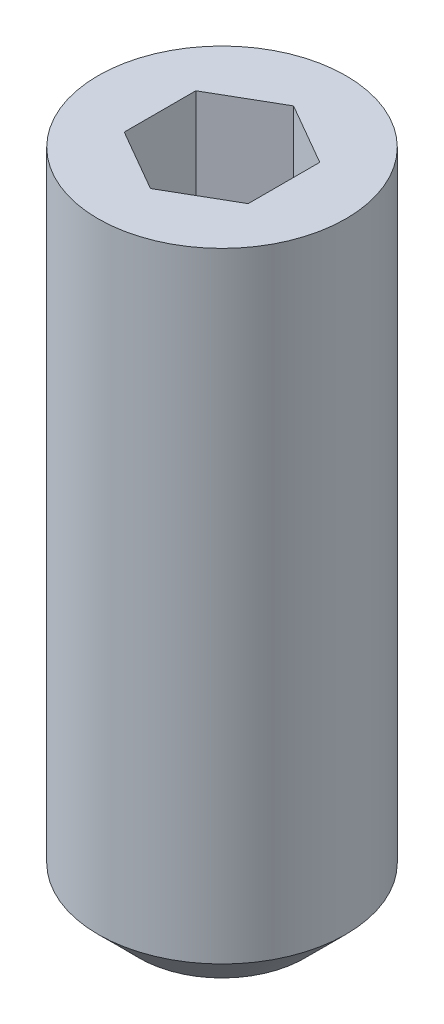
ISO-10303-21;
HEADER;
FILE_DESCRIPTION(('STEP AP214'),'2;1');
FILE_NAME('part.step','',(''),(''),'','','');
FILE_SCHEMA(('AUTOMOTIVE_DESIGN { 1 0 10303 214 1 1 1 1 }'));
ENDSEC;
DATA;
#1=APPLICATION_CONTEXT('core data for automotive mechanical design processes');
#2=APPLICATION_PROTOCOL_DEFINITION('international standard','automotive_design',2000,#1);
#3=PRODUCT_CONTEXT('',#1,'mechanical');
#4=PRODUCT('Part','Part','',(#3));
#5=PRODUCT_RELATED_PRODUCT_CATEGORY('part','',(#4));
#6=PRODUCT_DEFINITION_FORMATION('','',#4);
#7=PRODUCT_DEFINITION_CONTEXT('part definition',#1,'design');
#8=PRODUCT_DEFINITION('design','',#6,#7);
#9=PRODUCT_DEFINITION_SHAPE('','',#8);
#10=(LENGTH_UNIT() NAMED_UNIT(*) SI_UNIT(.MILLI.,.METRE.));
#11=(NAMED_UNIT(*) PLANE_ANGLE_UNIT() SI_UNIT($,.RADIAN.));
#12=(NAMED_UNIT(*) SI_UNIT($,.STERADIAN.) SOLID_ANGLE_UNIT());
#13=UNCERTAINTY_MEASURE_WITH_UNIT(LENGTH_MEASURE(1.E-05),#10,'distance_accuracy_value','');
#14=(GEOMETRIC_REPRESENTATION_CONTEXT(3) GLOBAL_UNCERTAINTY_ASSIGNED_CONTEXT((#13)) GLOBAL_UNIT_ASSIGNED_CONTEXT((#10,
#11,#12)) REPRESENTATION_CONTEXT('',''));
#15=CARTESIAN_POINT('',(0.,0.,0.));
#16=DIRECTION('',(0.,0.,1.));
#17=DIRECTION('',(1.,0.,0.));
#18=AXIS2_PLACEMENT_3D('',#15,#16,#17);
#19=CARTESIAN_POINT('',(0.,0.,0.));
#20=DIRECTION('',(0.,1.,0.));
#21=DIRECTION('',(-1.,0.,0.));
#22=AXIS2_PLACEMENT_3D('',#19,#20,#21);
#23=CYLINDRICAL_SURFACE('',#22,1.5);
#24=CARTESIAN_POINT('',(0.,0.,0.));
#25=DIRECTION('',(0.,1.,0.));
#26=DIRECTION('',(-1.,0.,0.));
#27=AXIS2_PLACEMENT_3D('',#24,#25,#26);
#28=CIRCLE('',#27,1.5);
#29=CARTESIAN_POINT('',(-1.5,0.,0.));
#30=VERTEX_POINT('',#29);
#31=EDGE_CURVE('E11',#30,#30,#28,.T.);
#32=ORIENTED_EDGE('',*,*,#31,.F.);
#33=EDGE_LOOP('',(#32));
#34=FACE_BOUND('',#33,.T.);
#35=CARTESIAN_POINT('',(0.,-7.50000000000001,0.));
#36=DIRECTION('',(0.,1.,0.));
#37=DIRECTION('',(-1.,0.,0.));
#38=AXIS2_PLACEMENT_3D('',#35,#36,#37);
#39=CIRCLE('',#38,1.5);
#40=CARTESIAN_POINT('',(-1.5,-7.50000000000001,0.));
#41=VERTEX_POINT('',#40);
#42=EDGE_CURVE('E126',#41,#41,#39,.T.);
#43=ORIENTED_EDGE('',*,*,#42,.T.);
#44=EDGE_LOOP('',(#43));
#45=FACE_BOUND('',#44,.T.);
#46=ADVANCED_FACE('F34',(#34,#45),#23,.T.);
#47=CARTESIAN_POINT('',(0.,0.,0.));
#48=DIRECTION('',(0.,-1.,0.));
#49=DIRECTION('',(1.,0.,0.));
#50=AXIS2_PLACEMENT_3D('',#47,#48,#49);
#51=PLANE('',#50);
#52=ORIENTED_EDGE('',*,*,#31,.T.);
#53=EDGE_LOOP('',(#52));
#54=FACE_BOUND('',#53,.T.);
#55=DIRECTION('',(-0.866025403784439,0.,0.5));
#56=VECTOR('',#55,1.);
#57=CARTESIAN_POINT('',(0.,0.,-0.866025403784438));
#58=LINE('',#57,#56);
#59=CARTESIAN_POINT('',(0.,0.,-0.866025403784439));
#60=VERTEX_POINT('',#59);
#61=CARTESIAN_POINT('',(-0.75,0.,-0.433012701892219));
#62=VERTEX_POINT('',#61);
#63=EDGE_CURVE('E125',#60,#62,#58,.T.);
#64=ORIENTED_EDGE('',*,*,#63,.F.);
#65=DIRECTION('',(-0.866025403784439,0.,-0.499999999999999));
#66=VECTOR('',#65,1.);
#67=CARTESIAN_POINT('',(0.75,0.,-0.43301270189222));
#68=LINE('',#67,#66);
#69=CARTESIAN_POINT('',(0.75,0.,-0.43301270189222));
#70=VERTEX_POINT('',#69);
#71=EDGE_CURVE('E49',#70,#60,#68,.T.);
#72=ORIENTED_EDGE('',*,*,#71,.F.);
#73=DIRECTION('',(0.,0.,-1.));
#74=VECTOR('',#73,1.);
#75=CARTESIAN_POINT('',(0.75,0.,0.433012701892219));
#76=LINE('',#75,#74);
#77=CARTESIAN_POINT('',(0.75,0.,0.433012701892219));
#78=VERTEX_POINT('',#77);
#79=EDGE_CURVE('E78',#78,#70,#76,.T.);
#80=ORIENTED_EDGE('',*,*,#79,.F.);
#81=DIRECTION('',(0.866025403784438,0.,-0.5));
#82=VECTOR('',#81,1.);
#83=CARTESIAN_POINT('',(0.,0.,0.866025403784438));
#84=LINE('',#83,#82);
#85=CARTESIAN_POINT('',(0.,0.,0.866025403784438));
#86=VERTEX_POINT('',#85);
#87=EDGE_CURVE('E132',#86,#78,#84,.T.);
#88=ORIENTED_EDGE('',*,*,#87,.F.);
#89=DIRECTION('',(0.866025403784439,0.,0.5));
#90=VECTOR('',#89,1.);
#91=CARTESIAN_POINT('',(-0.75,0.,0.433012701892219));
#92=LINE('',#91,#90);
#93=CARTESIAN_POINT('',(-0.75,0.,0.433012701892219));
#94=VERTEX_POINT('',#93);
#95=EDGE_CURVE('E100',#94,#86,#92,.T.);
#96=ORIENTED_EDGE('',*,*,#95,.F.);
#97=DIRECTION('',(0.,0.,1.));
#98=VECTOR('',#97,1.);
#99=CARTESIAN_POINT('',(-0.75,0.,-0.433012701892219));
#100=LINE('',#99,#98);
#101=EDGE_CURVE('E129',#62,#94,#100,.T.);
#102=ORIENTED_EDGE('',*,*,#101,.F.);
#103=EDGE_LOOP('',(#64,#72,#80,#88,#96,#102));
#104=FACE_BOUND('',#103,.T.);
#105=ADVANCED_FACE('F145',(#54,#104),#51,.F.);
#106=CARTESIAN_POINT('',(0.75,-2.,-0.43301270189222));
#107=DIRECTION('',(0.5,0.,-0.866025403784439));
#108=DIRECTION('',(-0.866025403784439,0.,-0.5));
#109=AXIS2_PLACEMENT_3D('',#106,#107,#108);
#110=PLANE('',#109);
#111=ORIENTED_EDGE('',*,*,#71,.T.);
#112=DIRECTION('',(0.,1.,0.));
#113=VECTOR('',#112,1.);
#114=CARTESIAN_POINT('',(0.,-2.,-0.866025403784438));
#115=LINE('',#114,#113);
#116=CARTESIAN_POINT('',(0.,-2.,-0.866025403784438));
#117=VERTEX_POINT('',#116);
#118=EDGE_CURVE('E81',#117,#60,#115,.T.);
#119=ORIENTED_EDGE('',*,*,#118,.F.);
#120=DIRECTION('',(-0.866025403784439,0.,-0.499999999999999));
#121=VECTOR('',#120,1.);
#122=CARTESIAN_POINT('',(0.75,-2.,-0.43301270189222));
#123=LINE('',#122,#121);
#124=CARTESIAN_POINT('',(0.75,-2.,-0.43301270189222));
#125=VERTEX_POINT('',#124);
#126=EDGE_CURVE('E135',#125,#117,#123,.T.);
#127=ORIENTED_EDGE('',*,*,#126,.F.);
#128=DIRECTION('',(0.,1.,0.));
#129=VECTOR('',#128,1.);
#130=CARTESIAN_POINT('',(0.75,-2.,-0.43301270189222));
#131=LINE('',#130,#129);
#132=EDGE_CURVE('E42',#125,#70,#131,.T.);
#133=ORIENTED_EDGE('',*,*,#132,.T.);
#134=EDGE_LOOP('',(#111,#119,#127,#133));
#135=FACE_BOUND('',#134,.T.);
#136=ADVANCED_FACE('F169',(#135),#110,.F.);
#137=CARTESIAN_POINT('',(0.75,-2.,0.433012701892219));
#138=DIRECTION('',(1.,0.,0.));
#139=DIRECTION('',(0.,1.,0.));
#140=AXIS2_PLACEMENT_3D('',#137,#138,#139);
#141=PLANE('',#140);
#142=ORIENTED_EDGE('',*,*,#79,.T.);
#143=ORIENTED_EDGE('',*,*,#132,.F.);
#144=DIRECTION('',(0.,0.,-1.));
#145=VECTOR('',#144,1.);
#146=CARTESIAN_POINT('',(0.75,-2.,0.433012701892219));
#147=LINE('',#146,#145);
#148=CARTESIAN_POINT('',(0.75,-2.,0.433012701892219));
#149=VERTEX_POINT('',#148);
#150=EDGE_CURVE('E111',#149,#125,#147,.T.);
#151=ORIENTED_EDGE('',*,*,#150,.F.);
#152=DIRECTION('',(0.,1.,0.));
#153=VECTOR('',#152,1.);
#154=CARTESIAN_POINT('',(0.75,-2.,0.433012701892219));
#155=LINE('',#154,#153);
#156=EDGE_CURVE('E103',#149,#78,#155,.T.);
#157=ORIENTED_EDGE('',*,*,#156,.T.);
#158=EDGE_LOOP('',(#142,#143,#151,#157));
#159=FACE_BOUND('',#158,.T.);
#160=ADVANCED_FACE('F177',(#159),#141,.F.);
#161=CARTESIAN_POINT('',(0.,-2.,0.866025403784438));
#162=DIRECTION('',(0.5,0.,0.866025403784439));
#163=DIRECTION('',(0.866025403784438,0.,-0.5));
#164=AXIS2_PLACEMENT_3D('',#161,#162,#163);
#165=PLANE('',#164);
#166=ORIENTED_EDGE('',*,*,#87,.T.);
#167=ORIENTED_EDGE('',*,*,#156,.F.);
#168=DIRECTION('',(0.866025403784438,0.,-0.5));
#169=VECTOR('',#168,1.);
#170=CARTESIAN_POINT('',(0.,-2.,0.866025403784438));
#171=LINE('',#170,#169);
#172=CARTESIAN_POINT('',(0.,-2.,0.866025403784438));
#173=VERTEX_POINT('',#172);
#174=EDGE_CURVE('E107',#173,#149,#171,.T.);
#175=ORIENTED_EDGE('',*,*,#174,.F.);
#176=DIRECTION('',(0.,1.,0.));
#177=VECTOR('',#176,1.);
#178=CARTESIAN_POINT('',(0.,-2.,0.866025403784438));
#179=LINE('',#178,#177);
#180=EDGE_CURVE('E92',#173,#86,#179,.T.);
#181=ORIENTED_EDGE('',*,*,#180,.T.);
#182=EDGE_LOOP('',(#166,#167,#175,#181));
#183=FACE_BOUND('',#182,.T.);
#184=ADVANCED_FACE('F108',(#183),#165,.F.);
#185=CARTESIAN_POINT('',(-0.749999999999999,-2.,0.433012701892219));
#186=DIRECTION('',(-0.5,0.,0.866025403784439));
#187=DIRECTION('',(0.866025403784439,0.,0.5));
#188=AXIS2_PLACEMENT_3D('',#185,#186,#187);
#189=PLANE('',#188);
#190=ORIENTED_EDGE('',*,*,#95,.T.);
#191=ORIENTED_EDGE('',*,*,#180,.F.);
#192=DIRECTION('',(0.866025403784439,0.,0.5));
#193=VECTOR('',#192,1.);
#194=CARTESIAN_POINT('',(-0.749999999999999,-2.,0.433012701892219));
#195=LINE('',#194,#193);
#196=CARTESIAN_POINT('',(-0.749999999999999,-2.,0.433012701892219));
#197=VERTEX_POINT('',#196);
#198=EDGE_CURVE('E97',#197,#173,#195,.T.);
#199=ORIENTED_EDGE('',*,*,#198,.F.);
#200=DIRECTION('',(0.,1.,0.));
#201=VECTOR('',#200,1.);
#202=CARTESIAN_POINT('',(-0.749999999999999,-2.,0.433012701892219));
#203=LINE('',#202,#201);
#204=EDGE_CURVE('E104',#197,#94,#203,.T.);
#205=ORIENTED_EDGE('',*,*,#204,.T.);
#206=EDGE_LOOP('',(#190,#191,#199,#205));
#207=FACE_BOUND('',#206,.T.);
#208=ADVANCED_FACE('F94',(#207),#189,.F.);
#209=CARTESIAN_POINT('',(-0.749999999999999,-2.,-0.433012701892219));
#210=DIRECTION('',(-1.,0.,0.));
#211=DIRECTION('',(0.,0.,1.));
#212=AXIS2_PLACEMENT_3D('',#209,#210,#211);
#213=PLANE('',#212);
#214=DIRECTION('',(0.,1.,0.));
#215=VECTOR('',#214,1.);
#216=CARTESIAN_POINT('',(-0.749999999999999,-2.,-0.433012701892219));
#217=LINE('',#216,#215);
#218=CARTESIAN_POINT('',(-0.749999999999999,-2.,-0.433012701892219));
#219=VERTEX_POINT('',#218);
#220=EDGE_CURVE('E139',#219,#62,#217,.T.);
#221=ORIENTED_EDGE('',*,*,#220,.T.);
#222=ORIENTED_EDGE('',*,*,#101,.T.);
#223=ORIENTED_EDGE('',*,*,#204,.F.);
#224=DIRECTION('',(0.,0.,1.));
#225=VECTOR('',#224,1.);
#226=CARTESIAN_POINT('',(-0.749999999999999,-2.,-0.433012701892219));
#227=LINE('',#226,#225);
#228=EDGE_CURVE('E117',#219,#197,#227,.T.);
#229=ORIENTED_EDGE('',*,*,#228,.F.);
#230=EDGE_LOOP('',(#221,#222,#223,#229));
#231=FACE_BOUND('',#230,.T.);
#232=ADVANCED_FACE('F147',(#231),#213,.F.);
#233=CARTESIAN_POINT('',(0.,-2.,-0.866025403784438));
#234=DIRECTION('',(-0.5,0.,-0.866025403784439));
#235=DIRECTION('',(-0.866025403784439,0.,0.5));
#236=AXIS2_PLACEMENT_3D('',#233,#234,#235);
#237=PLANE('',#236);
#238=ORIENTED_EDGE('',*,*,#63,.T.);
#239=ORIENTED_EDGE('',*,*,#220,.F.);
#240=DIRECTION('',(-0.866025403784439,0.,0.5));
#241=VECTOR('',#240,1.);
#242=CARTESIAN_POINT('',(0.,-2.,-0.866025403784438));
#243=LINE('',#242,#241);
#244=EDGE_CURVE('E119',#117,#219,#243,.T.);
#245=ORIENTED_EDGE('',*,*,#244,.F.);
#246=ORIENTED_EDGE('',*,*,#118,.T.);
#247=EDGE_LOOP('',(#238,#239,#245,#246));
#248=FACE_BOUND('',#247,.T.);
#249=ADVANCED_FACE('F143',(#248),#237,.F.);
#250=CARTESIAN_POINT('',(0.,-2.,0.));
#251=DIRECTION('',(0.,1.,0.));
#252=DIRECTION('',(-1.,0.,0.));
#253=AXIS2_PLACEMENT_3D('',#250,#251,#252);
#254=PLANE('',#253);
#255=ORIENTED_EDGE('',*,*,#126,.T.);
#256=ORIENTED_EDGE('',*,*,#244,.T.);
#257=ORIENTED_EDGE('',*,*,#228,.T.);
#258=ORIENTED_EDGE('',*,*,#198,.T.);
#259=ORIENTED_EDGE('',*,*,#174,.T.);
#260=ORIENTED_EDGE('',*,*,#150,.T.);
#261=EDGE_LOOP('',(#255,#256,#257,#258,#259,#260));
#262=FACE_BOUND('',#261,.T.);
#263=ADVANCED_FACE('F114',(#262),#254,.T.);
#264=CARTESIAN_POINT('',(0.,-7.50000000000001,0.));
#265=DIRECTION('',(0.,1.,0.));
#266=DIRECTION('',(-1.,0.,0.));
#267=AXIS2_PLACEMENT_3D('',#264,#265,#266);
#268=CONICAL_SURFACE('',#267,1.5,0.785398163397453);
#269=CARTESIAN_POINT('',(0.,-8.,0.));
#270=DIRECTION('',(0.,1.,0.));
#271=DIRECTION('',(-1.,0.,0.));
#272=AXIS2_PLACEMENT_3D('',#269,#270,#271);
#273=CIRCLE('',#272,1.);
#274=CARTESIAN_POINT('',(-0.999999999999999,-8.,0.));
#275=VERTEX_POINT('',#274);
#276=EDGE_CURVE('E152',#275,#275,#273,.T.);
#277=ORIENTED_EDGE('',*,*,#276,.T.);
#278=EDGE_LOOP('',(#277));
#279=FACE_BOUND('',#278,.T.);
#280=ORIENTED_EDGE('',*,*,#42,.F.);
#281=EDGE_LOOP('',(#280));
#282=FACE_BOUND('',#281,.T.);
#283=ADVANCED_FACE('F156',(#279,#282),#268,.T.);
#284=CARTESIAN_POINT('',(0.,-8.,0.));
#285=DIRECTION('',(0.,1.,0.));
#286=DIRECTION('',(-1.,0.,0.));
#287=AXIS2_PLACEMENT_3D('',#284,#285,#286);
#288=PLANE('',#287);
#289=ORIENTED_EDGE('',*,*,#276,.F.);
#290=EDGE_LOOP('',(#289));
#291=FACE_BOUND('',#290,.T.);
#292=ADVANCED_FACE('F36',(#291),#288,.F.);
#293=CLOSED_SHELL('',(#46,#105,#136,#160,#184,#208,#232,#249,#263,#283,#292));
#294=MANIFOLD_SOLID_BREP('B2',#293);
#295=ADVANCED_BREP_SHAPE_REPRESENTATION('',(#18,#294),#14);
#296=SHAPE_DEFINITION_REPRESENTATION(#9,#295);
ENDSEC;
END-ISO-10303-21;
